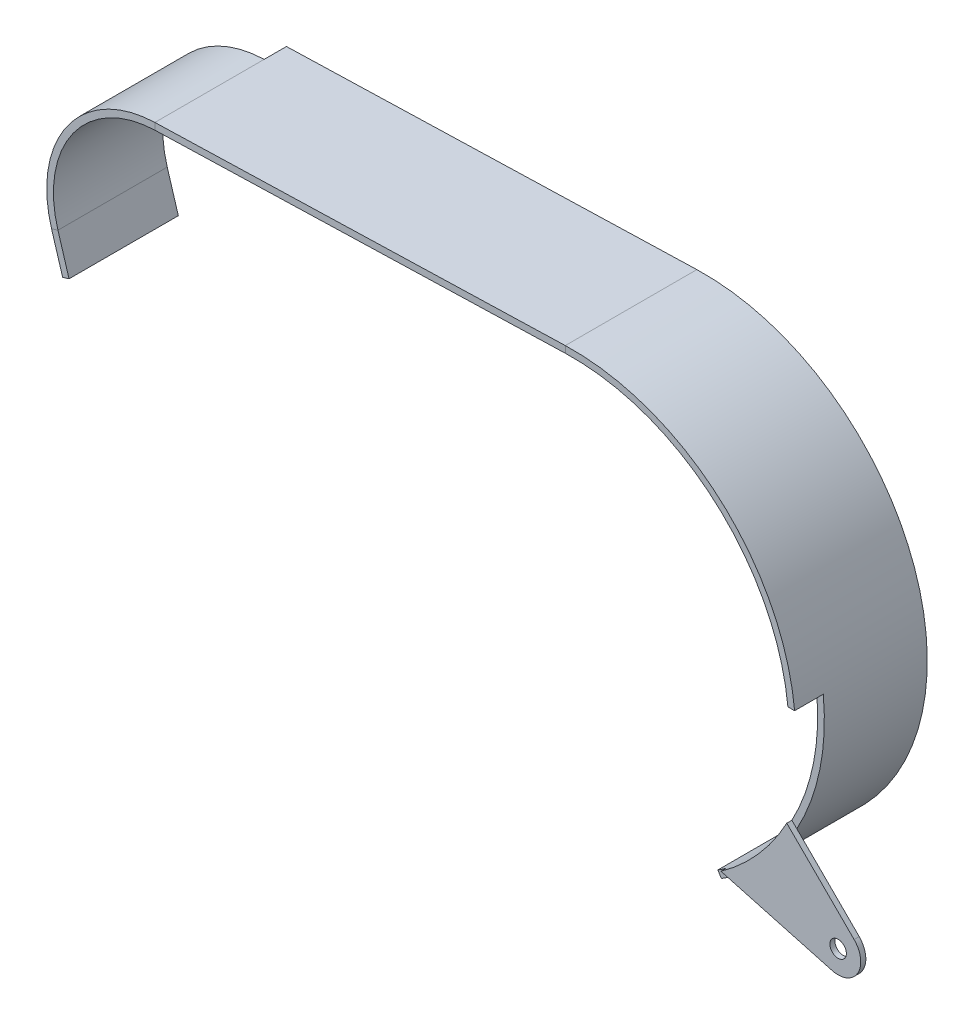
ISO-10303-21;
HEADER;
FILE_DESCRIPTION(('STEP AP214'),'2;1');
FILE_NAME('part.step','',(''),(''),'','','');
FILE_SCHEMA(('AUTOMOTIVE_DESIGN { 1 0 10303 214 1 1 1 1 }'));
ENDSEC;
DATA;
#1=APPLICATION_CONTEXT('core data for automotive mechanical design processes');
#2=APPLICATION_PROTOCOL_DEFINITION('international standard','automotive_design',2000,#1);
#3=PRODUCT_CONTEXT('',#1,'mechanical');
#4=PRODUCT('Part','Part','',(#3));
#5=PRODUCT_RELATED_PRODUCT_CATEGORY('part','',(#4));
#6=PRODUCT_DEFINITION_FORMATION('','',#4);
#7=PRODUCT_DEFINITION_CONTEXT('part definition',#1,'design');
#8=PRODUCT_DEFINITION('design','',#6,#7);
#9=PRODUCT_DEFINITION_SHAPE('','',#8);
#10=(LENGTH_UNIT() NAMED_UNIT(*) SI_UNIT(.MILLI.,.METRE.));
#11=(NAMED_UNIT(*) PLANE_ANGLE_UNIT() SI_UNIT($,.RADIAN.));
#12=(NAMED_UNIT(*) SI_UNIT($,.STERADIAN.) SOLID_ANGLE_UNIT());
#13=UNCERTAINTY_MEASURE_WITH_UNIT(LENGTH_MEASURE(1.E-05),#10,'distance_accuracy_value','');
#14=(GEOMETRIC_REPRESENTATION_CONTEXT(3) GLOBAL_UNCERTAINTY_ASSIGNED_CONTEXT((#13)) GLOBAL_UNIT_ASSIGNED_CONTEXT((#10,
#11,#12)) REPRESENTATION_CONTEXT('',''));
#15=CARTESIAN_POINT('',(0.,0.,0.));
#16=DIRECTION('',(0.,0.,1.));
#17=DIRECTION('',(1.,0.,0.));
#18=AXIS2_PLACEMENT_3D('',#15,#16,#17);
#19=CARTESIAN_POINT('',(9.85322934354826E-13,-4.71844785465692E-13,41.0718));
#20=DIRECTION('',(0.,0.,1.));
#21=DIRECTION('',(1.,0.,0.));
#22=AXIS2_PLACEMENT_3D('',#19,#20,#21);
#23=PLANE('',#22);
#24=CARTESIAN_POINT('',(-2.3037127760972E-12,1.10328413072125E-12,41.0718));
#25=DIRECTION('',(0.,0.,1.));
#26=DIRECTION('',(1.,0.,0.));
#27=AXIS2_PLACEMENT_3D('',#24,#25,#26);
#28=CIRCLE('',#27,89.340144705504);
#29=CARTESIAN_POINT('',(48.26,-75.184,41.0718));
#30=VERTEX_POINT('',#29);
#31=CARTESIAN_POINT('',(53.3938521107538,-71.6293097326432,41.0718));
#32=VERTEX_POINT('',#31);
#33=EDGE_CURVE('E221',#30,#32,#28,.T.);
#34=ORIENTED_EDGE('',*,*,#33,.T.);
#35=DIRECTION('',(0.964689214980953,-0.263390809443747,0.));
#36=VECTOR('',#35,1.);
#37=CARTESIAN_POINT('',(50.0963510471143,-70.7289871615955,41.0718));
#38=LINE('',#37,#36);
#39=CARTESIAN_POINT('',(50.0963510471143,-70.7289871615955,41.0718));
#40=VERTEX_POINT('',#39);
#41=EDGE_CURVE('E434',#40,#32,#38,.T.);
#42=ORIENTED_EDGE('',*,*,#41,.F.);
#43=CARTESIAN_POINT('',(9.85322934354826E-13,-4.71844785465692E-13,41.0718));
#44=DIRECTION('',(0.,0.,-1.));
#45=DIRECTION('',(1.,0.,0.));
#46=AXIS2_PLACEMENT_3D('',#43,#44,#45);
#47=CIRCLE('',#46,86.6731447055009);
#48=CARTESIAN_POINT('',(46.8193327565757,-72.9395920839285,41.0718));
#49=VERTEX_POINT('',#48);
#50=EDGE_CURVE('E203',#40,#49,#47,.T.);
#51=ORIENTED_EDGE('',*,*,#50,.T.);
#52=DIRECTION('',(0.540182693447428,-0.841547775054918,0.));
#53=VECTOR('',#52,1.);
#54=CARTESIAN_POINT('',(46.8193327565757,-72.9395920839285,41.0718));
#55=LINE('',#54,#53);
#56=EDGE_CURVE('E71',#49,#30,#55,.T.);
#57=ORIENTED_EDGE('',*,*,#56,.T.);
#58=EDGE_LOOP('',(#34,#42,#51,#57));
#59=FACE_BOUND('',#58,.T.);
#60=ADVANCED_FACE('F47',(#59),#23,.T.);
#61=CARTESIAN_POINT('',(86.2206371459766,8.84509713246272,41.0718));
#62=VERTEX_POINT('',#61);
#63=CARTESIAN_POINT('',(76.378066867499,-40.9710253072184,41.0718));
#64=VERTEX_POINT('',#63);
#65=EDGE_CURVE('E214',#62,#64,#47,.T.);
#66=ORIENTED_EDGE('',*,*,#65,.T.);
#67=DIRECTION('',(0.708385122805779,-0.705826124330519,0.));
#68=VECTOR('',#67,1.);
#69=CARTESIAN_POINT('',(17.5654501755452,17.6291343587541,41.0718));
#70=LINE('',#69,#68);
#71=CARTESIAN_POINT('',(78.3477422036692,-42.9335853101896,41.0718));
#72=VERTEX_POINT('',#71);
#73=EDGE_CURVE('E11',#64,#72,#70,.T.);
#74=ORIENTED_EDGE('',*,*,#73,.T.);
#75=CARTESIAN_POINT('',(88.9012132241023,8.84509713246273,41.0718));
#76=VERTEX_POINT('',#75);
#77=EDGE_CURVE('E220',#72,#76,#28,.T.);
#78=ORIENTED_EDGE('',*,*,#77,.T.);
#79=DIRECTION('',(-1.,0.,0.));
#80=VECTOR('',#79,1.);
#81=CARTESIAN_POINT('',(86.2206371459766,8.84509713246272,41.0718));
#82=LINE('',#81,#80);
#83=EDGE_CURVE('E224',#76,#62,#82,.T.);
#84=ORIENTED_EDGE('',*,*,#83,.T.);
#85=EDGE_LOOP('',(#66,#74,#78,#84));
#86=FACE_BOUND('',#85,.T.);
#87=ADVANCED_FACE('F460',(#86),#23,.T.);
#88=CARTESIAN_POINT('',(48.26,-75.184,52.5018));
#89=DIRECTION('',(-0.841547775054918,-0.540182693447428,0.));
#90=DIRECTION('',(0.540182693447428,-0.841547775054918,0.));
#91=AXIS2_PLACEMENT_3D('',#88,#89,#90);
#92=PLANE('',#91);
#93=DIRECTION('',(0.,0.,-1.));
#94=VECTOR('',#93,1.);
#95=CARTESIAN_POINT('',(48.26,-75.184,52.5018));
#96=LINE('',#95,#94);
#97=CARTESIAN_POINT('',(48.26,-75.184,0.));
#98=VERTEX_POINT('',#97);
#99=EDGE_CURVE('E351',#30,#98,#96,.T.);
#100=ORIENTED_EDGE('',*,*,#99,.F.);
#101=ORIENTED_EDGE('',*,*,#56,.F.);
#102=DIRECTION('',(0.,0.,-1.));
#103=VECTOR('',#102,1.);
#104=CARTESIAN_POINT('',(46.8193327565757,-72.9395920839285,52.5018));
#105=LINE('',#104,#103);
#106=CARTESIAN_POINT('',(46.8193327565757,-72.9395920839285,0.));
#107=VERTEX_POINT('',#106);
#108=EDGE_CURVE('E354',#49,#107,#105,.T.);
#109=ORIENTED_EDGE('',*,*,#108,.T.);
#110=DIRECTION('',(-0.540182693447428,0.841547775054918,0.));
#111=VECTOR('',#110,1.);
#112=CARTESIAN_POINT('',(48.26,-75.184,0.));
#113=LINE('',#112,#111);
#114=EDGE_CURVE('E305',#98,#107,#113,.T.);
#115=ORIENTED_EDGE('',*,*,#114,.F.);
#116=EDGE_LOOP('',(#100,#101,#109,#115));
#117=FACE_BOUND('',#116,.T.);
#118=ADVANCED_FACE('F431',(#117),#92,.T.);
#119=CARTESIAN_POINT('',(-166.39932716465,84.5122054907516,52.5018));
#120=DIRECTION('',(0.,0.,1.));
#121=DIRECTION('',(1.,0.,0.));
#122=AXIS2_PLACEMENT_3D('',#119,#120,#121);
#123=PLANE('',#122);
#124=DIRECTION('',(0.0292312073037012,-0.999572676957293,0.));
#125=VECTOR('',#124,1.);
#126=CARTESIAN_POINT('',(-166.39932716465,84.5122054907516,52.5018));
#127=LINE('',#126,#125);
#128=CARTESIAN_POINT('',(-166.39932716465,84.5122054907516,52.5018));
#129=VERTEX_POINT('',#128);
#130=CARTESIAN_POINT('',(-166.321367534771,81.8463451613066,52.5018));
#131=VERTEX_POINT('',#130);
#132=EDGE_CURVE('E56',#129,#131,#127,.T.);
#133=ORIENTED_EDGE('',*,*,#132,.F.);
#134=CARTESIAN_POINT('',(-165.1,40.0812,52.5018));
#135=DIRECTION('',(0.,0.,-1.));
#136=DIRECTION('',(-1.,0.,0.));
#137=AXIS2_PLACEMENT_3D('',#134,#135,#136);
#138=CIRCLE('',#137,44.45);
#139=CARTESIAN_POINT('',(-207.631458355599,27.1630906125561,52.5018));
#140=VERTEX_POINT('',#139);
#141=EDGE_CURVE('E277',#140,#129,#138,.T.);
#142=ORIENTED_EDGE('',*,*,#141,.F.);
#143=DIRECTION('',(-0.956838208224943,-0.290621133575796,0.));
#144=VECTOR('',#143,1.);
#145=CARTESIAN_POINT('',(-205.079570854263,27.9381771758027,52.5018));
#146=LINE('',#145,#144);
#147=CARTESIAN_POINT('',(-205.079570854263,27.9381771758027,52.5018));
#148=VERTEX_POINT('',#147);
#149=EDGE_CURVE('E367',#148,#140,#146,.T.);
#150=ORIENTED_EDGE('',*,*,#149,.F.);
#151=CARTESIAN_POINT('',(-165.1,40.0812,52.5018));
#152=DIRECTION('',(0.,0.,1.));
#153=DIRECTION('',(1.,0.,0.));
#154=AXIS2_PLACEMENT_3D('',#151,#152,#153);
#155=CIRCLE('',#154,41.783);
#156=EDGE_CURVE('E293',#148,#131,#155,.F.);
#157=ORIENTED_EDGE('',*,*,#156,.T.);
#158=EDGE_LOOP('',(#133,#142,#150,#157));
#159=FACE_BOUND('',#158,.T.);
#160=ADVANCED_FACE('F49',(#159),#123,.T.);
#161=CARTESIAN_POINT('',(-205.079570854263,27.9381771758027,52.5018));
#162=DIRECTION('',(0.,0.,1.));
#163=DIRECTION('',(1.,0.,0.));
#164=AXIS2_PLACEMENT_3D('',#161,#162,#163);
#165=PLANE('',#164);
#166=DIRECTION('',(0.999572676957293,0.0292312073037018,0.));
#167=VECTOR('',#166,1.);
#168=CARTESIAN_POINT('',(-166.39932716465,84.5122054907517,52.5018));
#169=LINE('',#168,#167);
#170=CARTESIAN_POINT('',(-2.61152029042924,89.3019676030303,52.5018));
#171=VERTEX_POINT('',#170);
#172=EDGE_CURVE('E273',#129,#171,#169,.T.);
#173=ORIENTED_EDGE('',*,*,#172,.F.);
#174=ORIENTED_EDGE('',*,*,#132,.T.);
#175=DIRECTION('',(0.999572676957293,0.0292312073037018,0.));
#176=VECTOR('',#175,1.);
#177=CARTESIAN_POINT('',(-166.321367534771,81.8463451613066,52.5018));
#178=LINE('',#177,#176);
#179=CARTESIAN_POINT('',(-2.53356066055027,86.6361072735852,52.5018));
#180=VERTEX_POINT('',#179);
#181=EDGE_CURVE('E297',#131,#180,#178,.T.);
#182=ORIENTED_EDGE('',*,*,#181,.T.);
#183=DIRECTION('',(-0.0292312073037017,0.999572676957293,0.));
#184=VECTOR('',#183,1.);
#185=CARTESIAN_POINT('',(-2.53356066055027,86.6361072735852,52.5018));
#186=LINE('',#185,#184);
#187=EDGE_CURVE('E360',#180,#171,#186,.T.);
#188=ORIENTED_EDGE('',*,*,#187,.T.);
#189=EDGE_LOOP('',(#173,#174,#182,#188));
#190=FACE_BOUND('',#189,.T.);
#191=ADVANCED_FACE('F372',(#190),#165,.T.);
#192=CARTESIAN_POINT('',(-2.53356066055027,86.6361072735852,52.5018));
#193=DIRECTION('',(0.,0.,1.));
#194=DIRECTION('',(1.,0.,0.));
#195=AXIS2_PLACEMENT_3D('',#192,#193,#194);
#196=PLANE('',#195);
#197=DIRECTION('',(-1.,0.,0.));
#198=VECTOR('',#197,1.);
#199=CARTESIAN_POINT('',(86.2206371459766,8.84509713246272,52.5018));
#200=LINE('',#199,#198);
#201=CARTESIAN_POINT('',(88.9012132241023,8.84509713246273,52.5018));
#202=VERTEX_POINT('',#201);
#203=CARTESIAN_POINT('',(86.2206371459766,8.84509713246272,52.5018));
#204=VERTEX_POINT('',#203);
#205=EDGE_CURVE('E205',#202,#204,#200,.T.);
#206=ORIENTED_EDGE('',*,*,#205,.F.);
#207=CARTESIAN_POINT('',(0.,0.,52.5018));
#208=DIRECTION('',(0.,0.,-1.));
#209=DIRECTION('',(-1.,0.,0.));
#210=AXIS2_PLACEMENT_3D('',#207,#208,#209);
#211=CIRCLE('',#210,89.3401447055018);
#212=EDGE_CURVE('E268',#171,#202,#211,.T.);
#213=ORIENTED_EDGE('',*,*,#212,.F.);
#214=ORIENTED_EDGE('',*,*,#187,.F.);
#215=CARTESIAN_POINT('',(0.,0.,52.5018));
#216=DIRECTION('',(0.,0.,1.));
#217=DIRECTION('',(1.,0.,0.));
#218=AXIS2_PLACEMENT_3D('',#215,#216,#217);
#219=CIRCLE('',#218,86.6731447055018);
#220=EDGE_CURVE('E264',#180,#204,#219,.F.);
#221=ORIENTED_EDGE('',*,*,#220,.T.);
#222=EDGE_LOOP('',(#206,#213,#214,#221));
#223=FACE_BOUND('',#222,.T.);
#224=ADVANCED_FACE('F390',(#223),#196,.T.);
#225=CARTESIAN_POINT('',(-2.61152029042924,89.3019676030303,0.));
#226=DIRECTION('',(0.,0.,-1.));
#227=DIRECTION('',(-1.,0.,0.));
#228=AXIS2_PLACEMENT_3D('',#225,#226,#227);
#229=PLANE('',#228);
#230=DIRECTION('',(0.0292312073037017,-0.999572676957293,0.));
#231=VECTOR('',#230,1.);
#232=CARTESIAN_POINT('',(-2.61152029042924,89.3019676030303,0.));
#233=LINE('',#232,#231);
#234=CARTESIAN_POINT('',(-2.61152029042924,89.3019676030303,0.));
#235=VERTEX_POINT('',#234);
#236=CARTESIAN_POINT('',(-2.53356066055027,86.6361072735852,0.));
#237=VERTEX_POINT('',#236);
#238=EDGE_CURVE('E357',#235,#237,#233,.T.);
#239=ORIENTED_EDGE('',*,*,#238,.F.);
#240=CARTESIAN_POINT('',(0.,0.,0.));
#241=DIRECTION('',(0.,0.,-1.));
#242=DIRECTION('',(-1.,0.,0.));
#243=AXIS2_PLACEMENT_3D('',#240,#241,#242);
#244=CIRCLE('',#243,89.3401447055018);
#245=EDGE_CURVE('E309',#235,#98,#244,.T.);
#246=ORIENTED_EDGE('',*,*,#245,.T.);
#247=ORIENTED_EDGE('',*,*,#114,.T.);
#248=CARTESIAN_POINT('',(0.,0.,0.));
#249=DIRECTION('',(0.,0.,1.));
#250=DIRECTION('',(1.,0.,0.));
#251=AXIS2_PLACEMENT_3D('',#248,#249,#250);
#252=CIRCLE('',#251,86.6731447055018);
#253=EDGE_CURVE('E261',#237,#107,#252,.F.);
#254=ORIENTED_EDGE('',*,*,#253,.F.);
#255=EDGE_LOOP('',(#239,#246,#247,#254));
#256=FACE_BOUND('',#255,.T.);
#257=ADVANCED_FACE('F427',(#256),#229,.T.);
#258=CARTESIAN_POINT('',(0.,0.,52.5018));
#259=DIRECTION('',(0.,0.,-1.));
#260=DIRECTION('',(-1.,0.,0.));
#261=AXIS2_PLACEMENT_3D('',#258,#259,#260);
#262=CYLINDRICAL_SURFACE('',#261,86.6731447055018);
#263=ORIENTED_EDGE('',*,*,#65,.F.);
#264=DIRECTION('',(0.,0.,1.));
#265=VECTOR('',#264,1.);
#266=CARTESIAN_POINT('',(86.2206371459766,8.84509713246272,41.0718));
#267=LINE('',#266,#265);
#268=EDGE_CURVE('E230',#62,#204,#267,.T.);
#269=ORIENTED_EDGE('',*,*,#268,.T.);
#270=ORIENTED_EDGE('',*,*,#220,.F.);
#271=DIRECTION('',(0.,0.,-1.));
#272=VECTOR('',#271,1.);
#273=CARTESIAN_POINT('',(-2.53356066055027,86.6361072735852,52.5018));
#274=LINE('',#273,#272);
#275=EDGE_CURVE('E301',#180,#237,#274,.T.);
#276=ORIENTED_EDGE('',*,*,#275,.T.);
#277=ORIENTED_EDGE('',*,*,#253,.T.);
#278=ORIENTED_EDGE('',*,*,#108,.F.);
#279=ORIENTED_EDGE('',*,*,#50,.F.);
#280=DIRECTION('',(0.,0.,-1.));
#281=VECTOR('',#280,1.);
#282=CARTESIAN_POINT('',(50.0963510471143,-70.7289871615955,43.1038));
#283=LINE('',#282,#281);
#284=CARTESIAN_POINT('',(50.0963510471143,-70.7289871615955,43.1038));
#285=VERTEX_POINT('',#284);
#286=EDGE_CURVE('E179',#285,#40,#283,.T.);
#287=ORIENTED_EDGE('',*,*,#286,.F.);
#288=CARTESIAN_POINT('',(-6.92501611609941E-12,5.61356516826095E-12,43.1038));
#289=DIRECTION('',(0.,0.,-1.));
#290=DIRECTION('',(-1.,0.,0.));
#291=AXIS2_PLACEMENT_3D('',#288,#289,#290);
#292=CIRCLE('',#291,86.6731447055106);
#293=CARTESIAN_POINT('',(76.378066867499,-40.9710253072184,43.1038));
#294=VERTEX_POINT('',#293);
#295=EDGE_CURVE('E187',#294,#285,#292,.T.);
#296=ORIENTED_EDGE('',*,*,#295,.F.);
#297=DIRECTION('',(0.,0.,-1.));
#298=VECTOR('',#297,1.);
#299=CARTESIAN_POINT('',(76.378066867499,-40.9710253072184,43.1038));
#300=LINE('',#299,#298);
#301=EDGE_CURVE('E448',#294,#64,#300,.T.);
#302=ORIENTED_EDGE('',*,*,#301,.T.);
#303=EDGE_LOOP('',(#263,#269,#270,#276,#277,#278,#279,#287,#296,#302));
#304=FACE_BOUND('',#303,.T.);
#305=ADVANCED_FACE('F201',(#304),#262,.F.);
#306=CARTESIAN_POINT('',(0.,0.,52.5018));
#307=DIRECTION('',(0.,0.,-1.));
#308=DIRECTION('',(-1.,0.,0.));
#309=AXIS2_PLACEMENT_3D('',#306,#307,#308);
#310=CYLINDRICAL_SURFACE('',#309,89.3401447055018);
#311=DIRECTION('',(0.,0.,1.));
#312=VECTOR('',#311,1.);
#313=CARTESIAN_POINT('',(88.9012132241023,8.84509713246273,41.0718));
#314=LINE('',#313,#312);
#315=EDGE_CURVE('E228',#76,#202,#314,.T.);
#316=ORIENTED_EDGE('',*,*,#315,.F.);
#317=ORIENTED_EDGE('',*,*,#77,.F.);
#318=EDGE_CURVE('E225',#32,#72,#28,.T.);
#319=ORIENTED_EDGE('',*,*,#318,.F.);
#320=ORIENTED_EDGE('',*,*,#33,.F.);
#321=ORIENTED_EDGE('',*,*,#99,.T.);
#322=ORIENTED_EDGE('',*,*,#245,.F.);
#323=DIRECTION('',(0.,0.,-1.));
#324=VECTOR('',#323,1.);
#325=CARTESIAN_POINT('',(-2.61152029042924,89.3019676030303,52.5018));
#326=LINE('',#325,#324);
#327=EDGE_CURVE('E347',#171,#235,#326,.T.);
#328=ORIENTED_EDGE('',*,*,#327,.F.);
#329=ORIENTED_EDGE('',*,*,#212,.T.);
#330=EDGE_LOOP('',(#316,#317,#319,#320,#321,#322,#328,#329));
#331=FACE_BOUND('',#330,.T.);
#332=ADVANCED_FACE('F396',(#331),#310,.T.);
#333=CARTESIAN_POINT('',(-166.39932716465,84.5122054907517,52.5018));
#334=DIRECTION('',(-0.0292312073037018,0.999572676957292,0.));
#335=DIRECTION('',(-0.999572676957293,-0.0292312073037018,0.));
#336=AXIS2_PLACEMENT_3D('',#333,#334,#335);
#337=PLANE('',#336);
#338=DIRECTION('',(0.999572676957293,0.0292312073037018,0.));
#339=VECTOR('',#338,1.);
#340=CARTESIAN_POINT('',(-166.39932716465,84.5122054907517,0.));
#341=LINE('',#340,#339);
#342=CARTESIAN_POINT('',(-166.39932716465,84.5122054907516,0.));
#343=VERTEX_POINT('',#342);
#344=EDGE_CURVE('E313',#343,#235,#341,.T.);
#345=ORIENTED_EDGE('',*,*,#344,.F.);
#346=DIRECTION('',(0.,0.,-1.));
#347=VECTOR('',#346,1.);
#348=CARTESIAN_POINT('',(-166.39932716465,84.5122054907517,8.89));
#349=LINE('',#348,#347);
#350=CARTESIAN_POINT('',(-166.39932716465,84.5122054907517,8.89));
#351=VERTEX_POINT('',#350);
#352=EDGE_CURVE('E256',#351,#343,#349,.T.);
#353=ORIENTED_EDGE('',*,*,#352,.F.);
#354=DIRECTION('',(0.,0.,-1.));
#355=VECTOR('',#354,1.);
#356=CARTESIAN_POINT('',(-166.39932716465,84.5122054907516,52.5018));
#357=LINE('',#356,#355);
#358=EDGE_CURVE('E343',#129,#351,#357,.T.);
#359=ORIENTED_EDGE('',*,*,#358,.F.);
#360=ORIENTED_EDGE('',*,*,#172,.T.);
#361=ORIENTED_EDGE('',*,*,#327,.T.);
#362=EDGE_LOOP('',(#345,#353,#359,#360,#361));
#363=FACE_BOUND('',#362,.T.);
#364=ADVANCED_FACE('F399',(#363),#337,.T.);
#365=CARTESIAN_POINT('',(-165.1,40.0812,52.5018));
#366=DIRECTION('',(0.,0.,-1.));
#367=DIRECTION('',(-1.,0.,0.));
#368=AXIS2_PLACEMENT_3D('',#365,#366,#367);
#369=CYLINDRICAL_SURFACE('',#368,44.45);
#370=CARTESIAN_POINT('',(-165.1,40.0811999999997,8.89));
#371=DIRECTION('',(0.,0.,-1.));
#372=DIRECTION('',(1.,0.,0.));
#373=AXIS2_PLACEMENT_3D('',#370,#371,#372);
#374=CIRCLE('',#373,44.4500000000003);
#375=CARTESIAN_POINT('',(-207.631458355599,27.1630906125561,8.89));
#376=VERTEX_POINT('',#375);
#377=EDGE_CURVE('E245',#376,#351,#374,.T.);
#378=ORIENTED_EDGE('',*,*,#377,.F.);
#379=DIRECTION('',(0.,0.,-1.));
#380=VECTOR('',#379,1.);
#381=CARTESIAN_POINT('',(-207.631458355599,27.1630906125561,52.5018));
#382=LINE('',#381,#380);
#383=EDGE_CURVE('E339',#140,#376,#382,.T.);
#384=ORIENTED_EDGE('',*,*,#383,.F.);
#385=ORIENTED_EDGE('',*,*,#141,.T.);
#386=ORIENTED_EDGE('',*,*,#358,.T.);
#387=EDGE_LOOP('',(#378,#384,#385,#386));
#388=FACE_BOUND('',#387,.T.);
#389=ADVANCED_FACE('F403',(#388),#369,.T.);
#390=CARTESIAN_POINT('',(-207.631458355599,27.1630906125561,52.5018));
#391=DIRECTION('',(-0.956838208224944,-0.290621133575791,0.));
#392=DIRECTION('',(0.290621133575791,-0.956838208224944,0.));
#393=AXIS2_PLACEMENT_3D('',#390,#391,#392);
#394=PLANE('',#393);
#395=DIRECTION('',(-0.290621133575791,0.956838208224944,0.));
#396=VECTOR('',#395,1.);
#397=CARTESIAN_POINT('',(-203.2,12.573,8.89));
#398=LINE('',#397,#396);
#399=CARTESIAN_POINT('',(-203.2,12.573,8.89));
#400=VERTEX_POINT('',#399);
#401=EDGE_CURVE('E242',#400,#376,#398,.T.);
#402=ORIENTED_EDGE('',*,*,#401,.F.);
#403=DIRECTION('',(0.,0.,-1.));
#404=VECTOR('',#403,1.);
#405=CARTESIAN_POINT('',(-203.2,12.573,52.5018));
#406=LINE('',#405,#404);
#407=CARTESIAN_POINT('',(-203.2,12.573,52.5018));
#408=VERTEX_POINT('',#407);
#409=EDGE_CURVE('E335',#408,#400,#406,.T.);
#410=ORIENTED_EDGE('',*,*,#409,.F.);
#411=DIRECTION('',(-0.290621133575791,0.956838208224944,0.));
#412=VECTOR('',#411,1.);
#413=CARTESIAN_POINT('',(-207.631458355599,27.1630906125561,52.5018));
#414=LINE('',#413,#412);
#415=EDGE_CURVE('E281',#408,#140,#414,.T.);
#416=ORIENTED_EDGE('',*,*,#415,.T.);
#417=ORIENTED_EDGE('',*,*,#383,.T.);
#418=EDGE_LOOP('',(#402,#410,#416,#417));
#419=FACE_BOUND('',#418,.T.);
#420=ADVANCED_FACE('F408',(#419),#394,.T.);
#421=CARTESIAN_POINT('',(-200.648112498664,13.3480865632466,52.5018));
#422=DIRECTION('',(0.290621133575791,-0.956838208224944,0.));
#423=DIRECTION('',(0.956838208224944,0.290621133575791,0.));
#424=AXIS2_PLACEMENT_3D('',#421,#422,#423);
#425=PLANE('',#424);
#426=DIRECTION('',(-0.956838208224944,-0.290621133575791,0.));
#427=VECTOR('',#426,1.);
#428=CARTESIAN_POINT('',(-200.648112498664,13.3480865632466,8.89));
#429=LINE('',#428,#427);
#430=CARTESIAN_POINT('',(-200.648112498664,13.3480865632466,8.89));
#431=VERTEX_POINT('',#430);
#432=EDGE_CURVE('E239',#431,#400,#429,.T.);
#433=ORIENTED_EDGE('',*,*,#432,.F.);
#434=DIRECTION('',(0.,0.,-1.));
#435=VECTOR('',#434,1.);
#436=CARTESIAN_POINT('',(-200.648112498664,13.3480865632466,52.5018));
#437=LINE('',#436,#435);
#438=CARTESIAN_POINT('',(-200.648112498664,13.3480865632466,52.5018));
#439=VERTEX_POINT('',#438);
#440=EDGE_CURVE('E331',#439,#431,#437,.T.);
#441=ORIENTED_EDGE('',*,*,#440,.F.);
#442=DIRECTION('',(-0.956838208224944,-0.290621133575791,0.));
#443=VECTOR('',#442,1.);
#444=CARTESIAN_POINT('',(-200.648112498664,13.3480865632466,52.5018));
#445=LINE('',#444,#443);
#446=EDGE_CURVE('E285',#439,#408,#445,.T.);
#447=ORIENTED_EDGE('',*,*,#446,.T.);
#448=ORIENTED_EDGE('',*,*,#409,.T.);
#449=EDGE_LOOP('',(#433,#441,#447,#448));
#450=FACE_BOUND('',#449,.T.);
#451=ADVANCED_FACE('F414',(#450),#425,.T.);
#452=CARTESIAN_POINT('',(-205.079570854263,27.9381771758027,52.5018));
#453=DIRECTION('',(-0.956838208224944,-0.290621133575791,0.));
#454=DIRECTION('',(0.290621133575791,-0.956838208224944,0.));
#455=AXIS2_PLACEMENT_3D('',#452,#453,#454);
#456=PLANE('',#455);
#457=ORIENTED_EDGE('',*,*,#440,.T.);
#458=DIRECTION('',(0.290621133575791,-0.956838208224944,0.));
#459=VECTOR('',#458,1.);
#460=CARTESIAN_POINT('',(-205.079570854263,27.9381771758027,8.89));
#461=LINE('',#460,#459);
#462=CARTESIAN_POINT('',(-205.079570854263,27.9381771758027,8.89));
#463=VERTEX_POINT('',#462);
#464=EDGE_CURVE('E234',#463,#431,#461,.T.);
#465=ORIENTED_EDGE('',*,*,#464,.F.);
#466=DIRECTION('',(0.,0.,-1.));
#467=VECTOR('',#466,1.);
#468=CARTESIAN_POINT('',(-205.079570854263,27.9381771758027,52.5018));
#469=LINE('',#468,#467);
#470=EDGE_CURVE('E327',#148,#463,#469,.T.);
#471=ORIENTED_EDGE('',*,*,#470,.F.);
#472=DIRECTION('',(-0.290621133575791,0.956838208224944,0.));
#473=VECTOR('',#472,1.);
#474=CARTESIAN_POINT('',(-205.079570854263,27.9381771758027,52.5018));
#475=LINE('',#474,#473);
#476=EDGE_CURVE('E289',#439,#148,#475,.T.);
#477=ORIENTED_EDGE('',*,*,#476,.F.);
#478=EDGE_LOOP('',(#457,#465,#471,#477));
#479=FACE_BOUND('',#478,.T.);
#480=ADVANCED_FACE('F419',(#479),#456,.F.);
#481=CARTESIAN_POINT('',(-165.1,40.0812,52.5018));
#482=DIRECTION('',(0.,0.,-1.));
#483=DIRECTION('',(-1.,0.,0.));
#484=AXIS2_PLACEMENT_3D('',#481,#482,#483);
#485=CYLINDRICAL_SURFACE('',#484,41.783);
#486=ORIENTED_EDGE('',*,*,#470,.T.);
#487=CARTESIAN_POINT('',(-165.1,40.0811999999998,8.89));
#488=DIRECTION('',(0.,0.,1.));
#489=DIRECTION('',(1.,0.,0.));
#490=AXIS2_PLACEMENT_3D('',#487,#488,#489);
#491=CIRCLE('',#490,41.7830000000002);
#492=CARTESIAN_POINT('',(-166.321367534771,81.8463451613066,8.89));
#493=VERTEX_POINT('',#492);
#494=EDGE_CURVE('E253',#493,#463,#491,.T.);
#495=ORIENTED_EDGE('',*,*,#494,.F.);
#496=DIRECTION('',(0.,0.,-1.));
#497=VECTOR('',#496,1.);
#498=CARTESIAN_POINT('',(-166.321367534771,81.8463451613066,52.5018));
#499=LINE('',#498,#497);
#500=EDGE_CURVE('E323',#131,#493,#499,.T.);
#501=ORIENTED_EDGE('',*,*,#500,.F.);
#502=ORIENTED_EDGE('',*,*,#156,.F.);
#503=EDGE_LOOP('',(#486,#495,#501,#502));
#504=FACE_BOUND('',#503,.T.);
#505=ADVANCED_FACE('F382',(#504),#485,.F.);
#506=CARTESIAN_POINT('',(-166.321367534771,81.8463451613066,52.5018));
#507=DIRECTION('',(-0.0292312073037018,0.999572676957293,0.));
#508=DIRECTION('',(-0.999572676957293,-0.0292312073037018,0.));
#509=AXIS2_PLACEMENT_3D('',#506,#507,#508);
#510=PLANE('',#509);
#511=DIRECTION('',(0.999572676957293,0.0292312073037018,0.));
#512=VECTOR('',#511,1.);
#513=CARTESIAN_POINT('',(-166.321367534771,81.8463451613066,0.));
#514=LINE('',#513,#512);
#515=CARTESIAN_POINT('',(-166.321367534771,81.8463451613066,0.));
#516=VERTEX_POINT('',#515);
#517=EDGE_CURVE('E269',#516,#237,#514,.T.);
#518=ORIENTED_EDGE('',*,*,#517,.T.);
#519=ORIENTED_EDGE('',*,*,#275,.F.);
#520=ORIENTED_EDGE('',*,*,#181,.F.);
#521=ORIENTED_EDGE('',*,*,#500,.T.);
#522=DIRECTION('',(0.,0.,-1.));
#523=VECTOR('',#522,1.);
#524=CARTESIAN_POINT('',(-166.321367534771,81.8463451613066,8.89));
#525=LINE('',#524,#523);
#526=EDGE_CURVE('E257',#493,#516,#525,.T.);
#527=ORIENTED_EDGE('',*,*,#526,.T.);
#528=EDGE_LOOP('',(#518,#519,#520,#521,#527));
#529=FACE_BOUND('',#528,.T.);
#530=ADVANCED_FACE('F384',(#529),#510,.F.);
#531=CARTESIAN_POINT('',(0.,0.,52.5018));
#532=DIRECTION('',(0.,0.,1.));
#533=DIRECTION('',(1.,0.,0.));
#534=AXIS2_PLACEMENT_3D('',#531,#532,#533);
#535=PLANE('',#534);
#536=ORIENTED_EDGE('',*,*,#476,.T.);
#537=ORIENTED_EDGE('',*,*,#149,.T.);
#538=ORIENTED_EDGE('',*,*,#415,.F.);
#539=ORIENTED_EDGE('',*,*,#446,.F.);
#540=EDGE_LOOP('',(#536,#537,#538,#539));
#541=FACE_BOUND('',#540,.T.);
#542=ADVANCED_FACE('F411',(#541),#535,.T.);
#543=CARTESIAN_POINT('',(0.,0.,0.));
#544=DIRECTION('',(0.,0.,1.));
#545=DIRECTION('',(1.,0.,0.));
#546=AXIS2_PLACEMENT_3D('',#543,#544,#545);
#547=PLANE('',#546);
#548=ORIENTED_EDGE('',*,*,#344,.T.);
#549=ORIENTED_EDGE('',*,*,#238,.T.);
#550=ORIENTED_EDGE('',*,*,#517,.F.);
#551=DIRECTION('',(-0.0292312073037012,0.999572676957293,0.));
#552=VECTOR('',#551,1.);
#553=CARTESIAN_POINT('',(-166.321367534771,81.8463451613066,0.));
#554=LINE('',#553,#552);
#555=EDGE_CURVE('E363',#516,#343,#554,.T.);
#556=ORIENTED_EDGE('',*,*,#555,.T.);
#557=EDGE_LOOP('',(#548,#549,#550,#556));
#558=FACE_BOUND('',#557,.T.);
#559=ADVANCED_FACE('F425',(#558),#547,.F.);
#560=CARTESIAN_POINT('',(-166.39932716465,84.5122054907516,8.89));
#561=DIRECTION('',(0.999572676957293,0.0292312073037012,0.));
#562=DIRECTION('',(-0.0292312073037012,0.999572676957293,0.));
#563=AXIS2_PLACEMENT_3D('',#560,#561,#562);
#564=PLANE('',#563);
#565=ORIENTED_EDGE('',*,*,#555,.F.);
#566=ORIENTED_EDGE('',*,*,#526,.F.);
#567=DIRECTION('',(0.0292312073037012,-0.999572676957293,0.));
#568=VECTOR('',#567,1.);
#569=CARTESIAN_POINT('',(-166.39932716465,84.5122054907516,8.89));
#570=LINE('',#569,#568);
#571=EDGE_CURVE('E249',#351,#493,#570,.T.);
#572=ORIENTED_EDGE('',*,*,#571,.F.);
#573=ORIENTED_EDGE('',*,*,#352,.T.);
#574=EDGE_LOOP('',(#565,#566,#572,#573));
#575=FACE_BOUND('',#574,.T.);
#576=ADVANCED_FACE('F423',(#575),#564,.F.);
#577=CARTESIAN_POINT('',(-165.1,40.0811999999997,8.89));
#578=DIRECTION('',(0.,0.,1.));
#579=DIRECTION('',(1.,0.,0.));
#580=AXIS2_PLACEMENT_3D('',#577,#578,#579);
#581=PLANE('',#580);
#582=ORIENTED_EDGE('',*,*,#464,.T.);
#583=ORIENTED_EDGE('',*,*,#432,.T.);
#584=ORIENTED_EDGE('',*,*,#401,.T.);
#585=ORIENTED_EDGE('',*,*,#377,.T.);
#586=ORIENTED_EDGE('',*,*,#571,.T.);
#587=ORIENTED_EDGE('',*,*,#494,.T.);
#588=EDGE_LOOP('',(#582,#583,#584,#585,#586,#587));
#589=FACE_BOUND('',#588,.T.);
#590=ADVANCED_FACE('F421',(#589),#581,.F.);
#591=CARTESIAN_POINT('',(86.2206371459766,8.84509713246272,41.0718));
#592=DIRECTION('',(0.,1.,0.));
#593=DIRECTION('',(0.,0.,1.));
#594=AXIS2_PLACEMENT_3D('',#591,#592,#593);
#595=PLANE('',#594);
#596=ORIENTED_EDGE('',*,*,#205,.T.);
#597=ORIENTED_EDGE('',*,*,#268,.F.);
#598=ORIENTED_EDGE('',*,*,#83,.F.);
#599=ORIENTED_EDGE('',*,*,#315,.T.);
#600=EDGE_LOOP('',(#596,#597,#598,#599));
#601=FACE_BOUND('',#600,.T.);
#602=ADVANCED_FACE('F465',(#601),#595,.F.);
#603=CARTESIAN_POINT('',(-6.92501611609941E-12,5.61356516826095E-12,43.1038));
#604=DIRECTION('',(0.,0.,-1.));
#605=DIRECTION('',(-1.,0.,0.));
#606=AXIS2_PLACEMENT_3D('',#603,#604,#605);
#607=PLANE('',#606);
#608=ORIENTED_EDGE('',*,*,#295,.T.);
#609=DIRECTION('',(0.964689214980953,-0.263390809443747,0.));
#610=VECTOR('',#609,1.);
#611=CARTESIAN_POINT('',(50.0963510471143,-70.7289871615955,43.1038));
#612=LINE('',#611,#610);
#613=CARTESIAN_POINT('',(94.4865448694038,-82.8489206081911,43.1038));
#614=VERTEX_POINT('',#613);
#615=EDGE_CURVE('E174',#285,#614,#612,.T.);
#616=ORIENTED_EDGE('',*,*,#615,.T.);
#617=CARTESIAN_POINT('',(96.8656185728011,-74.1353791290517,43.1038));
#618=DIRECTION('',(0.,0.,1.));
#619=DIRECTION('',(-1.,0.,0.));
#620=AXIS2_PLACEMENT_3D('',#617,#618,#619);
#621=CIRCLE('',#620,9.03248563767912);
#622=CARTESIAN_POINT('',(103.240982903515,-67.7369006813629,43.1038));
#623=VERTEX_POINT('',#622);
#624=EDGE_CURVE('E186',#614,#623,#621,.T.);
#625=ORIENTED_EDGE('',*,*,#624,.T.);
#626=DIRECTION('',(-0.708385122805779,0.705826124330519,0.));
#627=VECTOR('',#626,1.);
#628=CARTESIAN_POINT('',(76.378066867499,-40.9710253072184,43.1038));
#629=LINE('',#628,#627);
#630=EDGE_CURVE('E193',#623,#294,#629,.T.);
#631=ORIENTED_EDGE('',*,*,#630,.T.);
#632=EDGE_LOOP('',(#608,#616,#625,#631));
#633=FACE_BOUND('',#632,.T.);
#634=CARTESIAN_POINT('',(96.8656185728011,-74.1353791290517,43.1038));
#635=DIRECTION('',(0.,0.,1.));
#636=DIRECTION('',(1.,0.,0.));
#637=AXIS2_PLACEMENT_3D('',#634,#635,#636);
#638=CIRCLE('',#637,3.302);
#639=CARTESIAN_POINT('',(100.167618572801,-74.1353791290517,43.1038));
#640=VERTEX_POINT('',#639);
#641=EDGE_CURVE('E442',#640,#640,#638,.T.);
#642=ORIENTED_EDGE('',*,*,#641,.F.);
#643=EDGE_LOOP('',(#642));
#644=FACE_BOUND('',#643,.T.);
#645=ADVANCED_FACE('F190',(#633,#644),#607,.F.);
#646=CARTESIAN_POINT('',(-6.92501611609941E-12,5.61356516826095E-12,41.0718));
#647=DIRECTION('',(0.,0.,-1.));
#648=DIRECTION('',(-1.,0.,0.));
#649=AXIS2_PLACEMENT_3D('',#646,#647,#648);
#650=PLANE('',#649);
#651=CARTESIAN_POINT('',(94.4865448694038,-82.8489206081911,41.0718));
#652=VERTEX_POINT('',#651);
#653=EDGE_CURVE('E437',#32,#652,#38,.T.);
#654=ORIENTED_EDGE('',*,*,#653,.F.);
#655=ORIENTED_EDGE('',*,*,#318,.T.);
#656=DIRECTION('',(-0.708385122805779,0.705826124330519,0.));
#657=VECTOR('',#656,1.);
#658=CARTESIAN_POINT('',(76.378066867499,-40.9710253072184,41.0718));
#659=LINE('',#658,#657);
#660=CARTESIAN_POINT('',(103.240982903515,-67.7369006813629,41.0718));
#661=VERTEX_POINT('',#660);
#662=EDGE_CURVE('E63',#661,#72,#659,.T.);
#663=ORIENTED_EDGE('',*,*,#662,.F.);
#664=CARTESIAN_POINT('',(96.8656185728011,-74.1353791290517,41.0718));
#665=DIRECTION('',(0.,0.,1.));
#666=DIRECTION('',(-1.,0.,0.));
#667=AXIS2_PLACEMENT_3D('',#664,#665,#666);
#668=CIRCLE('',#667,9.03248563767912);
#669=EDGE_CURVE('E436',#652,#661,#668,.T.);
#670=ORIENTED_EDGE('',*,*,#669,.F.);
#671=EDGE_LOOP('',(#654,#655,#663,#670));
#672=FACE_BOUND('',#671,.T.);
#673=CARTESIAN_POINT('',(96.8656185728011,-74.1353791290517,41.0718));
#674=DIRECTION('',(0.,0.,1.));
#675=DIRECTION('',(1.,0.,0.));
#676=AXIS2_PLACEMENT_3D('',#673,#674,#675);
#677=CIRCLE('',#676,3.302);
#678=CARTESIAN_POINT('',(100.167618572801,-74.1353791290517,41.0718));
#679=VERTEX_POINT('',#678);
#680=EDGE_CURVE('E500',#679,#679,#677,.T.);
#681=ORIENTED_EDGE('',*,*,#680,.T.);
#682=EDGE_LOOP('',(#681));
#683=FACE_BOUND('',#682,.T.);
#684=ADVANCED_FACE('F456',(#672,#683),#650,.T.);
#685=CARTESIAN_POINT('',(50.0963510471143,-70.7289871615955,43.1038));
#686=DIRECTION('',(0.263390809443747,0.964689214980953,0.));
#687=DIRECTION('',(-0.964689214980953,0.263390809443747,0.));
#688=AXIS2_PLACEMENT_3D('',#685,#686,#687);
#689=PLANE('',#688);
#690=ORIENTED_EDGE('',*,*,#41,.T.);
#691=ORIENTED_EDGE('',*,*,#653,.T.);
#692=DIRECTION('',(0.,0.,-1.));
#693=VECTOR('',#692,1.);
#694=CARTESIAN_POINT('',(94.4865448694038,-82.8489206081911,43.1038));
#695=LINE('',#694,#693);
#696=EDGE_CURVE('E182',#614,#652,#695,.T.);
#697=ORIENTED_EDGE('',*,*,#696,.F.);
#698=ORIENTED_EDGE('',*,*,#615,.F.);
#699=ORIENTED_EDGE('',*,*,#286,.T.);
#700=EDGE_LOOP('',(#690,#691,#697,#698,#699));
#701=FACE_BOUND('',#700,.T.);
#702=ADVANCED_FACE('F177',(#701),#689,.F.);
#703=CARTESIAN_POINT('',(96.8656185728011,-74.1353791290517,43.1038));
#704=DIRECTION('',(0.,0.,-1.));
#705=DIRECTION('',(-1.,0.,0.));
#706=AXIS2_PLACEMENT_3D('',#703,#704,#705);
#707=CYLINDRICAL_SURFACE('',#706,9.03248563767912);
#708=ORIENTED_EDGE('',*,*,#669,.T.);
#709=DIRECTION('',(0.,0.,-1.));
#710=VECTOR('',#709,1.);
#711=CARTESIAN_POINT('',(103.240982903515,-67.7369006813629,43.1038));
#712=LINE('',#711,#710);
#713=EDGE_CURVE('E210',#623,#661,#712,.T.);
#714=ORIENTED_EDGE('',*,*,#713,.F.);
#715=ORIENTED_EDGE('',*,*,#624,.F.);
#716=ORIENTED_EDGE('',*,*,#696,.T.);
#717=EDGE_LOOP('',(#708,#714,#715,#716));
#718=FACE_BOUND('',#717,.T.);
#719=ADVANCED_FACE('F483',(#718),#707,.T.);
#720=CARTESIAN_POINT('',(76.378066867499,-40.9710253072184,43.1038));
#721=DIRECTION('',(-0.705826124330519,-0.708385122805779,0.));
#722=DIRECTION('',(0.708385122805779,-0.705826124330519,0.));
#723=AXIS2_PLACEMENT_3D('',#720,#721,#722);
#724=PLANE('',#723);
#725=ORIENTED_EDGE('',*,*,#662,.T.);
#726=ORIENTED_EDGE('',*,*,#73,.F.);
#727=ORIENTED_EDGE('',*,*,#301,.F.);
#728=ORIENTED_EDGE('',*,*,#630,.F.);
#729=ORIENTED_EDGE('',*,*,#713,.T.);
#730=EDGE_LOOP('',(#725,#726,#727,#728,#729));
#731=FACE_BOUND('',#730,.T.);
#732=ADVANCED_FACE('F452',(#731),#724,.F.);
#733=CARTESIAN_POINT('',(96.8656185728011,-74.1353791290517,43.1038));
#734=DIRECTION('',(0.,0.,-1.));
#735=DIRECTION('',(-1.,0.,0.));
#736=AXIS2_PLACEMENT_3D('',#733,#734,#735);
#737=CYLINDRICAL_SURFACE('',#736,3.302);
#738=ORIENTED_EDGE('',*,*,#641,.T.);
#739=EDGE_LOOP('',(#738));
#740=FACE_BOUND('',#739,.T.);
#741=ORIENTED_EDGE('',*,*,#680,.F.);
#742=EDGE_LOOP('',(#741));
#743=FACE_BOUND('',#742,.T.);
#744=ADVANCED_FACE('F488',(#740,#743),#737,.F.);
#745=CLOSED_SHELL('',(#60,#87,#118,#160,#191,#224,#257,#305,#332,#364,#389,#420,#451,#480,#505,
#530,#542,#559,#576,#590,#602,#645,#684,#702,#719,#732,#744));
#746=MANIFOLD_SOLID_BREP('B2',#745);
#747=ADVANCED_BREP_SHAPE_REPRESENTATION('',(#18,#746),#14);
#748=SHAPE_DEFINITION_REPRESENTATION(#9,#747);
ENDSEC;
END-ISO-10303-21;
